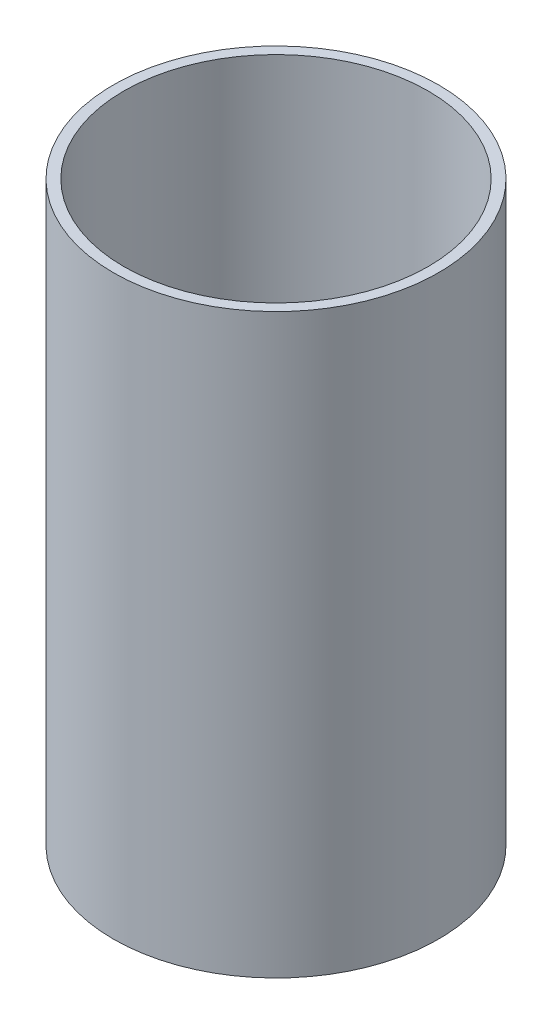
ISO-10303-21;
HEADER;
FILE_DESCRIPTION(('STEP AP214'),'2;1');
FILE_NAME('part.step','',(''),(''),'','','');
FILE_SCHEMA(('AUTOMOTIVE_DESIGN { 1 0 10303 214 1 1 1 1 }'));
ENDSEC;
DATA;
#1=APPLICATION_CONTEXT('core data for automotive mechanical design processes');
#2=APPLICATION_PROTOCOL_DEFINITION('international standard','automotive_design',2000,#1);
#3=PRODUCT_CONTEXT('',#1,'mechanical');
#4=PRODUCT('Part','Part','',(#3));
#5=PRODUCT_RELATED_PRODUCT_CATEGORY('part','',(#4));
#6=PRODUCT_DEFINITION_FORMATION('','',#4);
#7=PRODUCT_DEFINITION_CONTEXT('part definition',#1,'design');
#8=PRODUCT_DEFINITION('design','',#6,#7);
#9=PRODUCT_DEFINITION_SHAPE('','',#8);
#10=(LENGTH_UNIT() NAMED_UNIT(*) SI_UNIT(.MILLI.,.METRE.));
#11=(NAMED_UNIT(*) PLANE_ANGLE_UNIT() SI_UNIT($,.RADIAN.));
#12=(NAMED_UNIT(*) SI_UNIT($,.STERADIAN.) SOLID_ANGLE_UNIT());
#13=UNCERTAINTY_MEASURE_WITH_UNIT(LENGTH_MEASURE(1.E-05),#10,'distance_accuracy_value','');
#14=(GEOMETRIC_REPRESENTATION_CONTEXT(3) GLOBAL_UNCERTAINTY_ASSIGNED_CONTEXT((#13)) GLOBAL_UNIT_ASSIGNED_CONTEXT((#10,
#11,#12)) REPRESENTATION_CONTEXT('',''));
#15=CARTESIAN_POINT('',(0.,0.,0.));
#16=DIRECTION('',(0.,0.,1.));
#17=DIRECTION('',(1.,0.,0.));
#18=AXIS2_PLACEMENT_3D('',#15,#16,#17);
#19=CARTESIAN_POINT('',(0.,0.,0.));
#20=DIRECTION('',(0.,1.,0.));
#21=DIRECTION('',(0.,0.,1.));
#22=AXIS2_PLACEMENT_3D('',#19,#20,#21);
#23=PLANE('',#22);
#24=CARTESIAN_POINT('',(0.,0.,0.));
#25=DIRECTION('',(0.,1.,0.));
#26=DIRECTION('',(0.,0.,1.));
#27=AXIS2_PLACEMENT_3D('',#24,#25,#26);
#28=CIRCLE('',#27,31.);
#29=CARTESIAN_POINT('',(0.,0.,31.));
#30=VERTEX_POINT('',#29);
#31=EDGE_CURVE('E10',#30,#30,#28,.T.);
#32=ORIENTED_EDGE('',*,*,#31,.F.);
#33=EDGE_LOOP('',(#32));
#34=FACE_BOUND('',#33,.T.);
#35=ADVANCED_FACE('F37',(#34),#23,.F.);
#36=CARTESIAN_POINT('',(0.,2.,0.));
#37=DIRECTION('',(0.,1.,0.));
#38=DIRECTION('',(0.,0.,1.));
#39=AXIS2_PLACEMENT_3D('',#36,#37,#38);
#40=CYLINDRICAL_SURFACE('',#39,31.);
#41=CARTESIAN_POINT('',(0.,110.,0.));
#42=DIRECTION('',(0.,1.,0.));
#43=DIRECTION('',(0.,0.,1.));
#44=AXIS2_PLACEMENT_3D('',#41,#42,#43);
#45=CIRCLE('',#44,30.9999999999999);
#46=CARTESIAN_POINT('',(0.,110.,30.9999999999999));
#47=VERTEX_POINT('',#46);
#48=EDGE_CURVE('E44',#47,#47,#45,.T.);
#49=ORIENTED_EDGE('',*,*,#48,.F.);
#50=EDGE_LOOP('',(#49));
#51=FACE_BOUND('',#50,.T.);
#52=ORIENTED_EDGE('',*,*,#31,.T.);
#53=EDGE_LOOP('',(#52));
#54=FACE_BOUND('',#53,.T.);
#55=ADVANCED_FACE('F71',(#51,#54),#40,.T.);
#56=CARTESIAN_POINT('',(0.,110.,-31.));
#57=DIRECTION('',(0.,-1.,0.));
#58=DIRECTION('',(0.,0.,-1.));
#59=AXIS2_PLACEMENT_3D('',#56,#57,#58);
#60=PLANE('',#59);
#61=CARTESIAN_POINT('',(0.,110.,0.));
#62=DIRECTION('',(0.,1.,0.));
#63=DIRECTION('',(0.,0.,1.));
#64=AXIS2_PLACEMENT_3D('',#61,#62,#63);
#65=CIRCLE('',#64,28.9999999999999);
#66=CARTESIAN_POINT('',(0.,110.,28.9999999999999));
#67=VERTEX_POINT('',#66);
#68=EDGE_CURVE('E49',#67,#67,#65,.T.);
#69=ORIENTED_EDGE('',*,*,#68,.F.);
#70=EDGE_LOOP('',(#69));
#71=FACE_BOUND('',#70,.T.);
#72=ORIENTED_EDGE('',*,*,#48,.T.);
#73=EDGE_LOOP('',(#72));
#74=FACE_BOUND('',#73,.T.);
#75=ADVANCED_FACE('F66',(#71,#74),#60,.F.);
#76=CARTESIAN_POINT('',(0.,2.,0.));
#77=DIRECTION('',(0.,1.,0.));
#78=DIRECTION('',(0.,0.,1.));
#79=AXIS2_PLACEMENT_3D('',#76,#77,#78);
#80=CYLINDRICAL_SURFACE('',#79,29.);
#81=CARTESIAN_POINT('',(0.,2.00000000000002,0.));
#82=DIRECTION('',(0.,1.,0.));
#83=DIRECTION('',(0.,0.,1.));
#84=AXIS2_PLACEMENT_3D('',#81,#82,#83);
#85=CIRCLE('',#84,29.);
#86=CARTESIAN_POINT('',(0.,2.00000000000003,29.));
#87=VERTEX_POINT('',#86);
#88=EDGE_CURVE('E54',#87,#87,#85,.T.);
#89=ORIENTED_EDGE('',*,*,#88,.F.);
#90=EDGE_LOOP('',(#89));
#91=FACE_BOUND('',#90,.T.);
#92=ORIENTED_EDGE('',*,*,#68,.T.);
#93=EDGE_LOOP('',(#92));
#94=FACE_BOUND('',#93,.T.);
#95=ADVANCED_FACE('F63',(#91,#94),#80,.F.);
#96=CARTESIAN_POINT('',(0.,1.99999999999999,-29.));
#97=DIRECTION('',(0.,-1.,0.));
#98=DIRECTION('',(0.,0.,-1.));
#99=AXIS2_PLACEMENT_3D('',#96,#97,#98);
#100=PLANE('',#99);
#101=ORIENTED_EDGE('',*,*,#88,.T.);
#102=EDGE_LOOP('',(#101));
#103=FACE_BOUND('',#102,.T.);
#104=ADVANCED_FACE('F61',(#103),#100,.F.);
#105=CLOSED_SHELL('',(#35,#55,#75,#95,#104));
#106=MANIFOLD_SOLID_BREP('B2',#105);
#107=ADVANCED_BREP_SHAPE_REPRESENTATION('',(#18,#106),#14);
#108=SHAPE_DEFINITION_REPRESENTATION(#9,#107);
ENDSEC;
END-ISO-10303-21;
